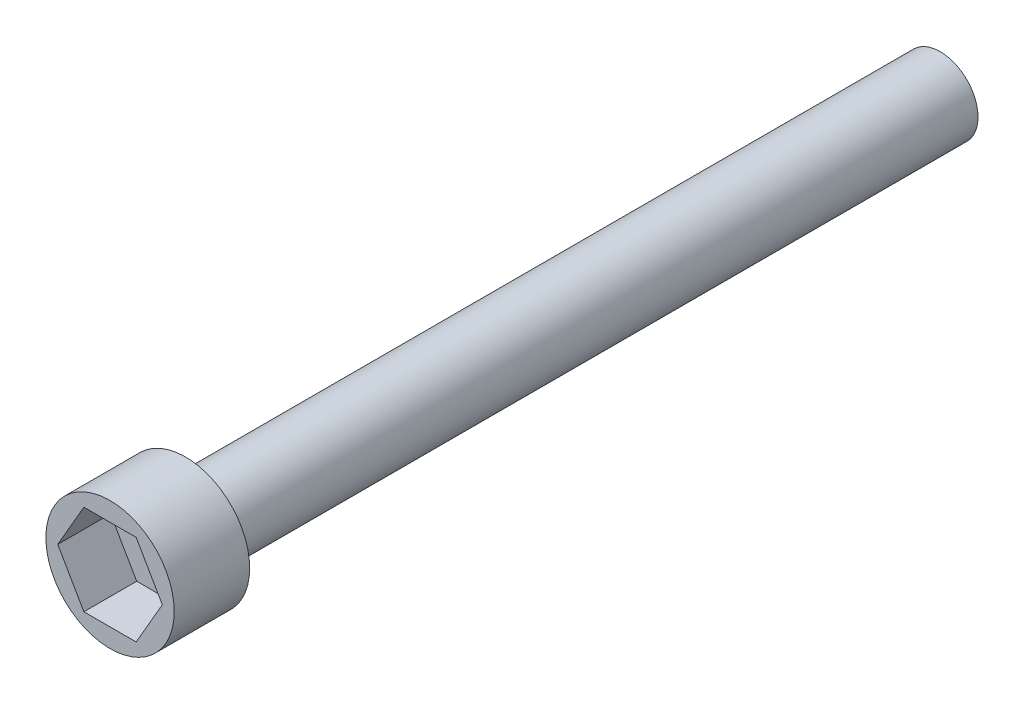
ISO-10303-21;
HEADER;
FILE_DESCRIPTION(('STEP AP214'),'2;1');
FILE_NAME('part.step','',(''),(''),'','','');
FILE_SCHEMA(('AUTOMOTIVE_DESIGN { 1 0 10303 214 1 1 1 1 }'));
ENDSEC;
DATA;
#1=APPLICATION_CONTEXT('core data for automotive mechanical design processes');
#2=APPLICATION_PROTOCOL_DEFINITION('international standard','automotive_design',2000,#1);
#3=PRODUCT_CONTEXT('',#1,'mechanical');
#4=PRODUCT('Part','Part','',(#3));
#5=PRODUCT_RELATED_PRODUCT_CATEGORY('part','',(#4));
#6=PRODUCT_DEFINITION_FORMATION('','',#4);
#7=PRODUCT_DEFINITION_CONTEXT('part definition',#1,'design');
#8=PRODUCT_DEFINITION('design','',#6,#7);
#9=PRODUCT_DEFINITION_SHAPE('','',#8);
#10=(LENGTH_UNIT() NAMED_UNIT(*) SI_UNIT(.MILLI.,.METRE.));
#11=(NAMED_UNIT(*) PLANE_ANGLE_UNIT() SI_UNIT($,.RADIAN.));
#12=(NAMED_UNIT(*) SI_UNIT($,.STERADIAN.) SOLID_ANGLE_UNIT());
#13=UNCERTAINTY_MEASURE_WITH_UNIT(LENGTH_MEASURE(1.E-05),#10,'distance_accuracy_value','');
#14=(GEOMETRIC_REPRESENTATION_CONTEXT(3) GLOBAL_UNCERTAINTY_ASSIGNED_CONTEXT((#13)) GLOBAL_UNIT_ASSIGNED_CONTEXT((#10,
#11,#12)) REPRESENTATION_CONTEXT('',''));
#15=CARTESIAN_POINT('',(0.,0.,0.));
#16=DIRECTION('',(0.,0.,1.));
#17=DIRECTION('',(1.,0.,0.));
#18=AXIS2_PLACEMENT_3D('',#15,#16,#17);
#19=CARTESIAN_POINT('',(0.,0.,50.));
#20=DIRECTION('',(0.,0.,-1.));
#21=DIRECTION('',(-1.,0.,0.));
#22=AXIS2_PLACEMENT_3D('',#19,#20,#21);
#23=CYLINDRICAL_SURFACE('',#22,2.5);
#24=CARTESIAN_POINT('',(0.,0.,50.));
#25=DIRECTION('',(0.,0.,1.));
#26=DIRECTION('',(1.,0.,0.));
#27=AXIS2_PLACEMENT_3D('',#24,#25,#26);
#28=CIRCLE('',#27,2.5);
#29=CARTESIAN_POINT('',(2.5,0.,50.));
#30=VERTEX_POINT('',#29);
#31=EDGE_CURVE('E11',#30,#30,#28,.T.);
#32=ORIENTED_EDGE('',*,*,#31,.F.);
#33=EDGE_LOOP('',(#32));
#34=FACE_BOUND('',#33,.T.);
#35=CARTESIAN_POINT('',(0.,0.,0.));
#36=DIRECTION('',(0.,0.,1.));
#37=DIRECTION('',(1.,0.,0.));
#38=AXIS2_PLACEMENT_3D('',#35,#36,#37);
#39=CIRCLE('',#38,2.5);
#40=CARTESIAN_POINT('',(2.5,0.,0.));
#41=VERTEX_POINT('',#40);
#42=EDGE_CURVE('E44',#41,#41,#39,.T.);
#43=ORIENTED_EDGE('',*,*,#42,.T.);
#44=EDGE_LOOP('',(#43));
#45=FACE_BOUND('',#44,.T.);
#46=ADVANCED_FACE('F41',(#34,#45),#23,.T.);
#47=CARTESIAN_POINT('',(0.,0.,0.));
#48=DIRECTION('',(0.,0.,1.));
#49=DIRECTION('',(1.,0.,0.));
#50=AXIS2_PLACEMENT_3D('',#47,#48,#49);
#51=PLANE('',#50);
#52=ORIENTED_EDGE('',*,*,#42,.F.);
#53=EDGE_LOOP('',(#52));
#54=FACE_BOUND('',#53,.T.);
#55=ADVANCED_FACE('F191',(#54),#51,.F.);
#56=CARTESIAN_POINT('',(0.,0.,55.));
#57=DIRECTION('',(0.,0.,-1.));
#58=DIRECTION('',(-1.,0.,0.));
#59=AXIS2_PLACEMENT_3D('',#56,#57,#58);
#60=CYLINDRICAL_SURFACE('',#59,4.25);
#61=CARTESIAN_POINT('',(0.,0.,55.));
#62=DIRECTION('',(0.,0.,1.));
#63=DIRECTION('',(1.,0.,0.));
#64=AXIS2_PLACEMENT_3D('',#61,#62,#63);
#65=CIRCLE('',#64,4.25);
#66=CARTESIAN_POINT('',(4.25,0.,55.));
#67=VERTEX_POINT('',#66);
#68=EDGE_CURVE('E165',#67,#67,#65,.T.);
#69=ORIENTED_EDGE('',*,*,#68,.F.);
#70=EDGE_LOOP('',(#69));
#71=FACE_BOUND('',#70,.T.);
#72=CARTESIAN_POINT('',(0.,0.,50.));
#73=DIRECTION('',(0.,0.,1.));
#74=DIRECTION('',(1.,0.,0.));
#75=AXIS2_PLACEMENT_3D('',#72,#73,#74);
#76=CIRCLE('',#75,4.25);
#77=CARTESIAN_POINT('',(4.25,0.,50.));
#78=VERTEX_POINT('',#77);
#79=EDGE_CURVE('E155',#78,#78,#76,.T.);
#80=ORIENTED_EDGE('',*,*,#79,.T.);
#81=EDGE_LOOP('',(#80));
#82=FACE_BOUND('',#81,.T.);
#83=ADVANCED_FACE('F173',(#71,#82),#60,.T.);
#84=CARTESIAN_POINT('',(0.,0.,55.));
#85=DIRECTION('',(0.,0.,1.));
#86=DIRECTION('',(1.,0.,0.));
#87=AXIS2_PLACEMENT_3D('',#84,#85,#86);
#88=PLANE('',#87);
#89=DIRECTION('',(0.5,0.866025403784439,0.));
#90=VECTOR('',#89,1.);
#91=CARTESIAN_POINT('',(1.73205080756888,-3.,55.));
#92=LINE('',#91,#90);
#93=CARTESIAN_POINT('',(1.73205080756888,-3.,55.));
#94=VERTEX_POINT('',#93);
#95=CARTESIAN_POINT('',(3.46410161513775,0.,55.));
#96=VERTEX_POINT('',#95);
#97=EDGE_CURVE('E56',#94,#96,#92,.T.);
#98=ORIENTED_EDGE('',*,*,#97,.F.);
#99=DIRECTION('',(1.,0.,0.));
#100=VECTOR('',#99,1.);
#101=CARTESIAN_POINT('',(-1.73205080756888,-3.,55.));
#102=LINE('',#101,#100);
#103=CARTESIAN_POINT('',(-1.73205080756888,-3.,55.));
#104=VERTEX_POINT('',#103);
#105=EDGE_CURVE('E149',#104,#94,#102,.T.);
#106=ORIENTED_EDGE('',*,*,#105,.F.);
#107=DIRECTION('',(0.5,-0.866025403784439,0.));
#108=VECTOR('',#107,1.);
#109=CARTESIAN_POINT('',(-3.46410161513775,0.,55.));
#110=LINE('',#109,#108);
#111=CARTESIAN_POINT('',(-3.46410161513775,0.,55.));
#112=VERTEX_POINT('',#111);
#113=EDGE_CURVE('E146',#112,#104,#110,.T.);
#114=ORIENTED_EDGE('',*,*,#113,.F.);
#115=DIRECTION('',(-0.5,-0.866025403784439,0.));
#116=VECTOR('',#115,1.);
#117=CARTESIAN_POINT('',(-1.73205080756888,3.,55.));
#118=LINE('',#117,#116);
#119=CARTESIAN_POINT('',(-1.73205080756888,3.,55.));
#120=VERTEX_POINT('',#119);
#121=EDGE_CURVE('E104',#120,#112,#118,.T.);
#122=ORIENTED_EDGE('',*,*,#121,.F.);
#123=DIRECTION('',(-1.,0.,0.));
#124=VECTOR('',#123,1.);
#125=CARTESIAN_POINT('',(1.73205080756888,3.,55.));
#126=LINE('',#125,#124);
#127=CARTESIAN_POINT('',(1.73205080756888,3.,55.));
#128=VERTEX_POINT('',#127);
#129=EDGE_CURVE('E140',#128,#120,#126,.T.);
#130=ORIENTED_EDGE('',*,*,#129,.F.);
#131=DIRECTION('',(-0.5,0.866025403784438,0.));
#132=VECTOR('',#131,1.);
#133=CARTESIAN_POINT('',(3.46410161513775,0.,55.));
#134=LINE('',#133,#132);
#135=EDGE_CURVE('E136',#96,#128,#134,.T.);
#136=ORIENTED_EDGE('',*,*,#135,.F.);
#137=EDGE_LOOP('',(#98,#106,#114,#122,#130,#136));
#138=FACE_BOUND('',#137,.T.);
#139=ORIENTED_EDGE('',*,*,#68,.T.);
#140=EDGE_LOOP('',(#139));
#141=FACE_BOUND('',#140,.T.);
#142=ADVANCED_FACE('F178',(#138,#141),#88,.T.);
#143=CARTESIAN_POINT('',(0.,0.,50.));
#144=DIRECTION('',(0.,0.,1.));
#145=DIRECTION('',(1.,0.,0.));
#146=AXIS2_PLACEMENT_3D('',#143,#144,#145);
#147=PLANE('',#146);
#148=ORIENTED_EDGE('',*,*,#31,.T.);
#149=EDGE_LOOP('',(#148));
#150=FACE_BOUND('',#149,.T.);
#151=ORIENTED_EDGE('',*,*,#79,.F.);
#152=EDGE_LOOP('',(#151));
#153=FACE_BOUND('',#152,.T.);
#154=ADVANCED_FACE('F175',(#150,#153),#147,.F.);
#155=CARTESIAN_POINT('',(1.73205080756888,-3.,51.5));
#156=DIRECTION('',(0.866025403784439,-0.5,0.));
#157=DIRECTION('',(0.5,0.866025403784439,0.));
#158=AXIS2_PLACEMENT_3D('',#155,#156,#157);
#159=PLANE('',#158);
#160=ORIENTED_EDGE('',*,*,#97,.T.);
#161=DIRECTION('',(0.,0.,1.));
#162=VECTOR('',#161,1.);
#163=CARTESIAN_POINT('',(3.46410161513775,0.,51.5));
#164=LINE('',#163,#162);
#165=CARTESIAN_POINT('',(3.46410161513775,0.,51.5));
#166=VERTEX_POINT('',#165);
#167=EDGE_CURVE('E86',#166,#96,#164,.T.);
#168=ORIENTED_EDGE('',*,*,#167,.F.);
#169=DIRECTION('',(0.5,0.866025403784439,0.));
#170=VECTOR('',#169,1.);
#171=CARTESIAN_POINT('',(1.73205080756888,-3.,51.5));
#172=LINE('',#171,#170);
#173=CARTESIAN_POINT('',(1.73205080756888,-3.,51.5));
#174=VERTEX_POINT('',#173);
#175=EDGE_CURVE('E152',#174,#166,#172,.T.);
#176=ORIENTED_EDGE('',*,*,#175,.F.);
#177=DIRECTION('',(0.,0.,1.));
#178=VECTOR('',#177,1.);
#179=CARTESIAN_POINT('',(1.73205080756888,-3.,51.5));
#180=LINE('',#179,#178);
#181=EDGE_CURVE('E64',#174,#94,#180,.T.);
#182=ORIENTED_EDGE('',*,*,#181,.T.);
#183=EDGE_LOOP('',(#160,#168,#176,#182));
#184=FACE_BOUND('',#183,.T.);
#185=ADVANCED_FACE('F177',(#184),#159,.F.);
#186=CARTESIAN_POINT('',(-1.73205080756888,-3.,51.5));
#187=DIRECTION('',(0.,-1.,0.));
#188=DIRECTION('',(0.,0.,-1.));
#189=AXIS2_PLACEMENT_3D('',#186,#187,#188);
#190=PLANE('',#189);
#191=ORIENTED_EDGE('',*,*,#105,.T.);
#192=ORIENTED_EDGE('',*,*,#181,.F.);
#193=DIRECTION('',(1.,0.,0.));
#194=VECTOR('',#193,1.);
#195=CARTESIAN_POINT('',(-1.73205080756888,-3.,51.5));
#196=LINE('',#195,#194);
#197=CARTESIAN_POINT('',(-1.73205080756888,-3.,51.5));
#198=VERTEX_POINT('',#197);
#199=EDGE_CURVE('E118',#198,#174,#196,.T.);
#200=ORIENTED_EDGE('',*,*,#199,.F.);
#201=DIRECTION('',(0.,0.,1.));
#202=VECTOR('',#201,1.);
#203=CARTESIAN_POINT('',(-1.73205080756888,-3.,51.5));
#204=LINE('',#203,#202);
#205=EDGE_CURVE('E109',#198,#104,#204,.T.);
#206=ORIENTED_EDGE('',*,*,#205,.T.);
#207=EDGE_LOOP('',(#191,#192,#200,#206));
#208=FACE_BOUND('',#207,.T.);
#209=ADVANCED_FACE('F185',(#208),#190,.F.);
#210=CARTESIAN_POINT('',(-3.46410161513775,0.,51.5));
#211=DIRECTION('',(-0.866025403784439,-0.5,0.));
#212=DIRECTION('',(0.5,-0.866025403784439,0.));
#213=AXIS2_PLACEMENT_3D('',#210,#211,#212);
#214=PLANE('',#213);
#215=ORIENTED_EDGE('',*,*,#113,.T.);
#216=ORIENTED_EDGE('',*,*,#205,.F.);
#217=DIRECTION('',(0.5,-0.866025403784439,0.));
#218=VECTOR('',#217,1.);
#219=CARTESIAN_POINT('',(-3.46410161513775,0.,51.5));
#220=LINE('',#219,#218);
#221=CARTESIAN_POINT('',(-3.46410161513775,0.,51.5));
#222=VERTEX_POINT('',#221);
#223=EDGE_CURVE('E113',#222,#198,#220,.T.);
#224=ORIENTED_EDGE('',*,*,#223,.F.);
#225=DIRECTION('',(0.,0.,1.));
#226=VECTOR('',#225,1.);
#227=CARTESIAN_POINT('',(-3.46410161513775,0.,51.5));
#228=LINE('',#227,#226);
#229=EDGE_CURVE('E97',#222,#112,#228,.T.);
#230=ORIENTED_EDGE('',*,*,#229,.T.);
#231=EDGE_LOOP('',(#215,#216,#224,#230));
#232=FACE_BOUND('',#231,.T.);
#233=ADVANCED_FACE('F114',(#232),#214,.F.);
#234=CARTESIAN_POINT('',(-1.73205080756888,3.,51.5));
#235=DIRECTION('',(-0.866025403784439,0.5,0.));
#236=DIRECTION('',(-0.5,-0.866025403784439,0.));
#237=AXIS2_PLACEMENT_3D('',#234,#235,#236);
#238=PLANE('',#237);
#239=ORIENTED_EDGE('',*,*,#121,.T.);
#240=ORIENTED_EDGE('',*,*,#229,.F.);
#241=DIRECTION('',(-0.5,-0.866025403784439,0.));
#242=VECTOR('',#241,1.);
#243=CARTESIAN_POINT('',(-1.73205080756888,3.,51.5));
#244=LINE('',#243,#242);
#245=CARTESIAN_POINT('',(-1.73205080756888,3.,51.5));
#246=VERTEX_POINT('',#245);
#247=EDGE_CURVE('E101',#246,#222,#244,.T.);
#248=ORIENTED_EDGE('',*,*,#247,.F.);
#249=DIRECTION('',(0.,0.,1.));
#250=VECTOR('',#249,1.);
#251=CARTESIAN_POINT('',(-1.73205080756888,3.,51.5));
#252=LINE('',#251,#250);
#253=EDGE_CURVE('E110',#246,#120,#252,.T.);
#254=ORIENTED_EDGE('',*,*,#253,.T.);
#255=EDGE_LOOP('',(#239,#240,#248,#254));
#256=FACE_BOUND('',#255,.T.);
#257=ADVANCED_FACE('F99',(#256),#238,.F.);
#258=CARTESIAN_POINT('',(1.73205080756888,3.,51.5));
#259=DIRECTION('',(0.,1.,0.));
#260=DIRECTION('',(0.,0.,1.));
#261=AXIS2_PLACEMENT_3D('',#258,#259,#260);
#262=PLANE('',#261);
#263=ORIENTED_EDGE('',*,*,#129,.T.);
#264=ORIENTED_EDGE('',*,*,#253,.F.);
#265=DIRECTION('',(-1.,0.,0.));
#266=VECTOR('',#265,1.);
#267=CARTESIAN_POINT('',(1.73205080756888,3.,51.5));
#268=LINE('',#267,#266);
#269=CARTESIAN_POINT('',(1.73205080756888,3.,51.5));
#270=VERTEX_POINT('',#269);
#271=EDGE_CURVE('E124',#270,#246,#268,.T.);
#272=ORIENTED_EDGE('',*,*,#271,.F.);
#273=DIRECTION('',(0.,0.,1.));
#274=VECTOR('',#273,1.);
#275=CARTESIAN_POINT('',(1.73205080756888,3.,51.5));
#276=LINE('',#275,#274);
#277=EDGE_CURVE('E160',#270,#128,#276,.T.);
#278=ORIENTED_EDGE('',*,*,#277,.T.);
#279=EDGE_LOOP('',(#263,#264,#272,#278));
#280=FACE_BOUND('',#279,.T.);
#281=ADVANCED_FACE('F247',(#280),#262,.F.);
#282=CARTESIAN_POINT('',(3.46410161513775,0.,51.5));
#283=DIRECTION('',(0.866025403784438,0.5,0.));
#284=DIRECTION('',(-0.5,0.866025403784439,0.));
#285=AXIS2_PLACEMENT_3D('',#282,#283,#284);
#286=PLANE('',#285);
#287=ORIENTED_EDGE('',*,*,#135,.T.);
#288=ORIENTED_EDGE('',*,*,#277,.F.);
#289=DIRECTION('',(-0.5,0.866025403784438,0.));
#290=VECTOR('',#289,1.);
#291=CARTESIAN_POINT('',(3.46410161513775,0.,51.5));
#292=LINE('',#291,#290);
#293=EDGE_CURVE('E128',#166,#270,#292,.T.);
#294=ORIENTED_EDGE('',*,*,#293,.F.);
#295=ORIENTED_EDGE('',*,*,#167,.T.);
#296=EDGE_LOOP('',(#287,#288,#294,#295));
#297=FACE_BOUND('',#296,.T.);
#298=ADVANCED_FACE('F256',(#297),#286,.F.);
#299=CARTESIAN_POINT('',(0.,0.,51.5));
#300=DIRECTION('',(0.,0.,1.));
#301=DIRECTION('',(1.,0.,0.));
#302=AXIS2_PLACEMENT_3D('',#299,#300,#301);
#303=PLANE('',#302);
#304=ORIENTED_EDGE('',*,*,#175,.T.);
#305=ORIENTED_EDGE('',*,*,#293,.T.);
#306=ORIENTED_EDGE('',*,*,#271,.T.);
#307=ORIENTED_EDGE('',*,*,#247,.T.);
#308=ORIENTED_EDGE('',*,*,#223,.T.);
#309=ORIENTED_EDGE('',*,*,#199,.T.);
#310=EDGE_LOOP('',(#304,#305,#306,#307,#308,#309));
#311=FACE_BOUND('',#310,.T.);
#312=ADVANCED_FACE('F121',(#311),#303,.T.);
#313=CLOSED_SHELL('',(#46,#55,#83,#142,#154,#185,#209,#233,#257,#281,#298,#312));
#314=MANIFOLD_SOLID_BREP('B2',#313);
#315=ADVANCED_BREP_SHAPE_REPRESENTATION('',(#18,#314),#14);
#316=SHAPE_DEFINITION_REPRESENTATION(#9,#315);
ENDSEC;
END-ISO-10303-21;
